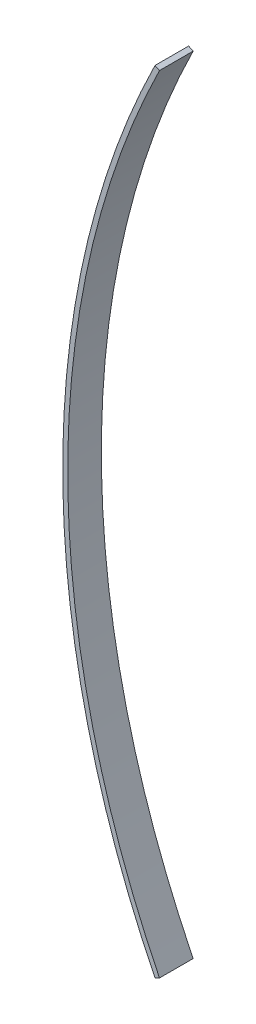
ISO-10303-21;
HEADER;
FILE_DESCRIPTION(('STEP AP214'),'2;1');
FILE_NAME('part.step','',(''),(''),'','','');
FILE_SCHEMA(('AUTOMOTIVE_DESIGN { 1 0 10303 214 1 1 1 1 }'));
ENDSEC;
DATA;
#1=APPLICATION_CONTEXT('core data for automotive mechanical design processes');
#2=APPLICATION_PROTOCOL_DEFINITION('international standard','automotive_design',2000,#1);
#3=PRODUCT_CONTEXT('',#1,'mechanical');
#4=PRODUCT('Part','Part','',(#3));
#5=PRODUCT_RELATED_PRODUCT_CATEGORY('part','',(#4));
#6=PRODUCT_DEFINITION_FORMATION('','',#4);
#7=PRODUCT_DEFINITION_CONTEXT('part definition',#1,'design');
#8=PRODUCT_DEFINITION('design','',#6,#7);
#9=PRODUCT_DEFINITION_SHAPE('','',#8);
#10=(LENGTH_UNIT() NAMED_UNIT(*) SI_UNIT(.MILLI.,.METRE.));
#11=(NAMED_UNIT(*) PLANE_ANGLE_UNIT() SI_UNIT($,.RADIAN.));
#12=(NAMED_UNIT(*) SI_UNIT($,.STERADIAN.) SOLID_ANGLE_UNIT());
#13=UNCERTAINTY_MEASURE_WITH_UNIT(LENGTH_MEASURE(1.E-05),#10,'distance_accuracy_value','');
#14=(GEOMETRIC_REPRESENTATION_CONTEXT(3) GLOBAL_UNCERTAINTY_ASSIGNED_CONTEXT((#13)) GLOBAL_UNIT_ASSIGNED_CONTEXT((#10,
#11,#12)) REPRESENTATION_CONTEXT('',''));
#15=CARTESIAN_POINT('',(0.,0.,0.));
#16=DIRECTION('',(0.,0.,1.));
#17=DIRECTION('',(1.,0.,0.));
#18=AXIS2_PLACEMENT_3D('',#15,#16,#17);
#19=CARTESIAN_POINT('',(178.25,84.2680326867253,-6.75));
#20=DIRECTION('',(0.,0.,1.));
#21=DIRECTION('',(1.,0.,0.));
#22=AXIS2_PLACEMENT_3D('',#19,#20,#21);
#23=CYLINDRICAL_SURFACE('',#22,179.);
#24=CARTESIAN_POINT('',(178.25,84.2680326867253,0.));
#25=DIRECTION('',(0.,0.,1.));
#26=DIRECTION('',(1.,0.,0.));
#27=AXIS2_PLACEMENT_3D('',#24,#25,#26);
#28=CIRCLE('',#27,179.);
#29=CARTESIAN_POINT('',(17.7686425388101,163.556959450895,0.));
#30=VERTEX_POINT('',#29);
#31=CARTESIAN_POINT('',(17.7686425388123,4.97910592255159,0.));
#32=VERTEX_POINT('',#31);
#33=EDGE_CURVE('E98',#30,#32,#28,.T.);
#34=ORIENTED_EDGE('',*,*,#33,.F.);
#35=DIRECTION('',(0.,0.,1.));
#36=VECTOR('',#35,1.);
#37=CARTESIAN_POINT('',(17.7686425388101,163.556959450895,-6.75));
#38=LINE('',#37,#36);
#39=CARTESIAN_POINT('',(17.7686425388101,163.556959450895,-6.75));
#40=VERTEX_POINT('',#39);
#41=EDGE_CURVE('E11',#40,#30,#38,.T.);
#42=ORIENTED_EDGE('',*,*,#41,.F.);
#43=CARTESIAN_POINT('',(178.25,84.2680326867253,-6.75));
#44=DIRECTION('',(0.,0.,1.));
#45=DIRECTION('',(1.,0.,0.));
#46=AXIS2_PLACEMENT_3D('',#43,#44,#45);
#47=CIRCLE('',#46,179.);
#48=CARTESIAN_POINT('',(17.7686425388123,4.97910592255159,-6.75));
#49=VERTEX_POINT('',#48);
#50=EDGE_CURVE('E93',#40,#49,#47,.T.);
#51=ORIENTED_EDGE('',*,*,#50,.T.);
#52=DIRECTION('',(0.,0.,1.));
#53=VECTOR('',#52,1.);
#54=CARTESIAN_POINT('',(17.7686425388123,4.97910592255159,-6.75));
#55=LINE('',#54,#53);
#56=EDGE_CURVE('E36',#49,#32,#55,.T.);
#57=ORIENTED_EDGE('',*,*,#56,.T.);
#58=EDGE_LOOP('',(#34,#42,#51,#57));
#59=FACE_BOUND('',#58,.T.);
#60=ADVANCED_FACE('F33',(#59),#23,.T.);
#61=CARTESIAN_POINT('',(17.7686425388101,163.556959450895,-6.75));
#62=DIRECTION('',(-0.442954898123846,-0.89654389643123,0.));
#63=DIRECTION('',(0.896543896431231,-0.442954898123847,0.));
#64=AXIS2_PLACEMENT_3D('',#61,#62,#63);
#65=PLANE('',#64);
#66=DIRECTION('',(0.89654389643123,-0.442954898123846,0.));
#67=VECTOR('',#66,1.);
#68=CARTESIAN_POINT('',(17.7686425388101,163.556959450895,0.));
#69=LINE('',#68,#67);
#70=CARTESIAN_POINT('',(18.6651864352413,163.114004552771,0.));
#71=VERTEX_POINT('',#70);
#72=EDGE_CURVE('E66',#30,#71,#69,.T.);
#73=ORIENTED_EDGE('',*,*,#72,.T.);
#74=DIRECTION('',(0.,0.,1.));
#75=VECTOR('',#74,1.);
#76=CARTESIAN_POINT('',(18.6651864352413,163.114004552771,-6.75));
#77=LINE('',#76,#75);
#78=CARTESIAN_POINT('',(18.6651864352413,163.114004552771,-6.75));
#79=VERTEX_POINT('',#78);
#80=EDGE_CURVE('E42',#79,#71,#77,.T.);
#81=ORIENTED_EDGE('',*,*,#80,.F.);
#82=DIRECTION('',(0.89654389643123,-0.442954898123846,0.));
#83=VECTOR('',#82,1.);
#84=CARTESIAN_POINT('',(17.7686425388101,163.556959450895,-6.75));
#85=LINE('',#84,#83);
#86=EDGE_CURVE('E81',#40,#79,#85,.T.);
#87=ORIENTED_EDGE('',*,*,#86,.F.);
#88=ORIENTED_EDGE('',*,*,#41,.T.);
#89=EDGE_LOOP('',(#73,#81,#87,#88));
#90=FACE_BOUND('',#89,.T.);
#91=ADVANCED_FACE('F108',(#90),#65,.F.);
#92=CARTESIAN_POINT('',(178.25,84.2680326867253,-6.75));
#93=DIRECTION('',(0.,0.,1.));
#94=DIRECTION('',(1.,0.,0.));
#95=AXIS2_PLACEMENT_3D('',#92,#93,#94);
#96=CYLINDRICAL_SURFACE('',#95,178.);
#97=CARTESIAN_POINT('',(178.25,84.2680326867253,0.));
#98=DIRECTION('',(0.,0.,1.));
#99=DIRECTION('',(1.,0.,0.));
#100=AXIS2_PLACEMENT_3D('',#97,#98,#99);
#101=CIRCLE('',#100,178.);
#102=CARTESIAN_POINT('',(18.6651864352436,5.4220608206754,0.));
#103=VERTEX_POINT('',#102);
#104=EDGE_CURVE('E88',#71,#103,#101,.T.);
#105=ORIENTED_EDGE('',*,*,#104,.T.);
#106=DIRECTION('',(0.,0.,1.));
#107=VECTOR('',#106,1.);
#108=CARTESIAN_POINT('',(18.6651864352436,5.4220608206754,-6.75));
#109=LINE('',#108,#107);
#110=CARTESIAN_POINT('',(18.6651864352436,5.4220608206754,-6.75));
#111=VERTEX_POINT('',#110);
#112=EDGE_CURVE('E85',#111,#103,#109,.T.);
#113=ORIENTED_EDGE('',*,*,#112,.F.);
#114=CARTESIAN_POINT('',(178.25,84.2680326867253,-6.75));
#115=DIRECTION('',(0.,0.,1.));
#116=DIRECTION('',(1.,0.,0.));
#117=AXIS2_PLACEMENT_3D('',#114,#115,#116);
#118=CIRCLE('',#117,178.);
#119=EDGE_CURVE('E78',#79,#111,#118,.T.);
#120=ORIENTED_EDGE('',*,*,#119,.F.);
#121=ORIENTED_EDGE('',*,*,#80,.T.);
#122=EDGE_LOOP('',(#105,#113,#120,#121));
#123=FACE_BOUND('',#122,.T.);
#124=ADVANCED_FACE('F86',(#123),#96,.F.);
#125=CARTESIAN_POINT('',(18.6651864352436,5.4220608206754,-6.75));
#126=DIRECTION('',(-0.442954898123802,0.896543896431252,0.));
#127=DIRECTION('',(-0.896543896431252,-0.442954898123802,0.));
#128=AXIS2_PLACEMENT_3D('',#125,#126,#127);
#129=PLANE('',#128);
#130=DIRECTION('',(-0.896543896431252,-0.442954898123802,0.));
#131=VECTOR('',#130,1.);
#132=CARTESIAN_POINT('',(18.6651864352436,5.4220608206754,0.));
#133=LINE('',#132,#131);
#134=EDGE_CURVE('E101',#103,#32,#133,.T.);
#135=ORIENTED_EDGE('',*,*,#134,.T.);
#136=ORIENTED_EDGE('',*,*,#56,.F.);
#137=DIRECTION('',(-0.896543896431252,-0.442954898123802,0.));
#138=VECTOR('',#137,1.);
#139=CARTESIAN_POINT('',(18.6651864352436,5.4220608206754,-6.75));
#140=LINE('',#139,#138);
#141=EDGE_CURVE('E75',#111,#49,#140,.T.);
#142=ORIENTED_EDGE('',*,*,#141,.F.);
#143=ORIENTED_EDGE('',*,*,#112,.T.);
#144=EDGE_LOOP('',(#135,#136,#142,#143));
#145=FACE_BOUND('',#144,.T.);
#146=ADVANCED_FACE('F92',(#145),#129,.F.);
#147=CARTESIAN_POINT('',(178.25,84.2680326867253,-6.75));
#148=DIRECTION('',(0.,0.,1.));
#149=DIRECTION('',(1.,0.,0.));
#150=AXIS2_PLACEMENT_3D('',#147,#148,#149);
#151=PLANE('',#150);
#152=ORIENTED_EDGE('',*,*,#50,.F.);
#153=ORIENTED_EDGE('',*,*,#86,.T.);
#154=ORIENTED_EDGE('',*,*,#119,.T.);
#155=ORIENTED_EDGE('',*,*,#141,.T.);
#156=EDGE_LOOP('',(#152,#153,#154,#155));
#157=FACE_BOUND('',#156,.T.);
#158=ADVANCED_FACE('F80',(#157),#151,.F.);
#159=CARTESIAN_POINT('',(178.25,84.2680326867253,0.));
#160=DIRECTION('',(0.,0.,1.));
#161=DIRECTION('',(1.,0.,0.));
#162=AXIS2_PLACEMENT_3D('',#159,#160,#161);
#163=PLANE('',#162);
#164=ORIENTED_EDGE('',*,*,#33,.T.);
#165=ORIENTED_EDGE('',*,*,#134,.F.);
#166=ORIENTED_EDGE('',*,*,#104,.F.);
#167=ORIENTED_EDGE('',*,*,#72,.F.);
#168=EDGE_LOOP('',(#164,#165,#166,#167));
#169=FACE_BOUND('',#168,.T.);
#170=ADVANCED_FACE('F106',(#169),#163,.T.);
#171=CLOSED_SHELL('',(#60,#91,#124,#146,#158,#170));
#172=MANIFOLD_SOLID_BREP('B2',#171);
#173=ADVANCED_BREP_SHAPE_REPRESENTATION('',(#18,#172),#14);
#174=SHAPE_DEFINITION_REPRESENTATION(#9,#173);
ENDSEC;
END-ISO-10303-21;
